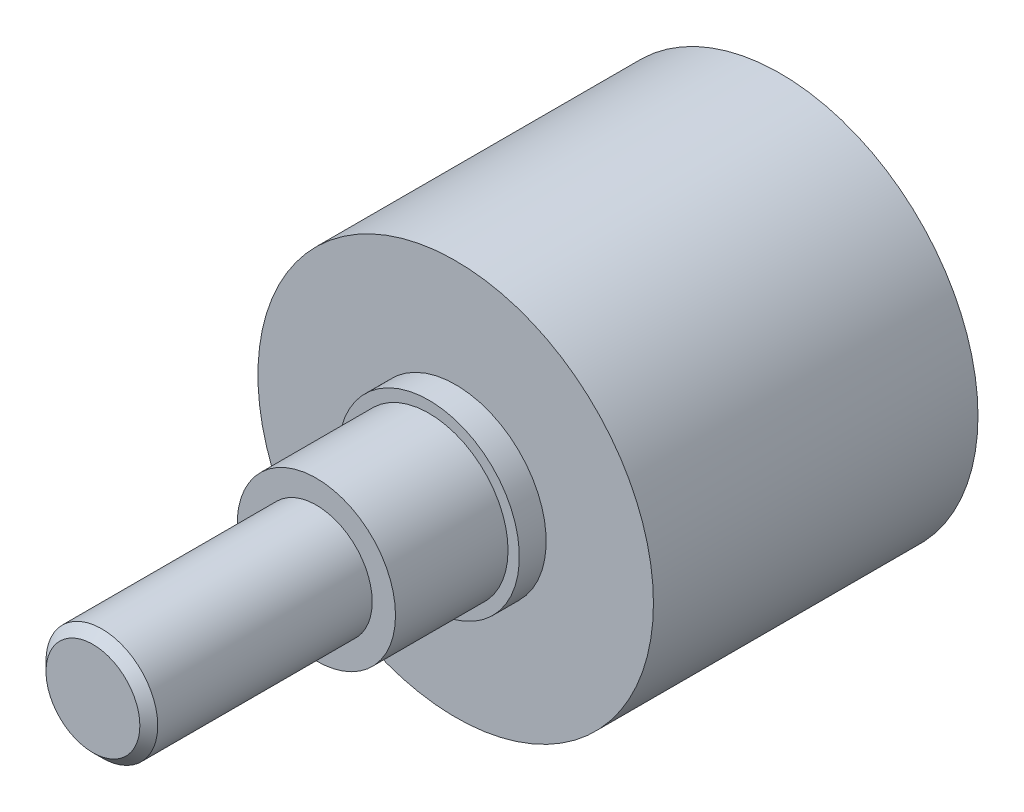
ISO-10303-21;
HEADER;
FILE_DESCRIPTION(('STEP AP214'),'2;1');
FILE_NAME('part.step','',(''),(''),'','','');
FILE_SCHEMA(('AUTOMOTIVE_DESIGN { 1 0 10303 214 1 1 1 1 }'));
ENDSEC;
DATA;
#1=APPLICATION_CONTEXT('core data for automotive mechanical design processes');
#2=APPLICATION_PROTOCOL_DEFINITION('international standard','automotive_design',2000,#1);
#3=PRODUCT_CONTEXT('',#1,'mechanical');
#4=PRODUCT('Part','Part','',(#3));
#5=PRODUCT_RELATED_PRODUCT_CATEGORY('part','',(#4));
#6=PRODUCT_DEFINITION_FORMATION('','',#4);
#7=PRODUCT_DEFINITION_CONTEXT('part definition',#1,'design');
#8=PRODUCT_DEFINITION('design','',#6,#7);
#9=PRODUCT_DEFINITION_SHAPE('','',#8);
#10=(LENGTH_UNIT() NAMED_UNIT(*) SI_UNIT(.MILLI.,.METRE.));
#11=(NAMED_UNIT(*) PLANE_ANGLE_UNIT() SI_UNIT($,.RADIAN.));
#12=(NAMED_UNIT(*) SI_UNIT($,.STERADIAN.) SOLID_ANGLE_UNIT());
#13=UNCERTAINTY_MEASURE_WITH_UNIT(LENGTH_MEASURE(1.E-05),#10,'distance_accuracy_value','');
#14=(GEOMETRIC_REPRESENTATION_CONTEXT(3) GLOBAL_UNCERTAINTY_ASSIGNED_CONTEXT((#13)) GLOBAL_UNIT_ASSIGNED_CONTEXT((#10,
#11,#12)) REPRESENTATION_CONTEXT('',''));
#15=CARTESIAN_POINT('',(0.,0.,0.));
#16=DIRECTION('',(0.,0.,1.));
#17=DIRECTION('',(1.,0.,0.));
#18=AXIS2_PLACEMENT_3D('',#15,#16,#17);
#19=CARTESIAN_POINT('',(0.,0.,26.366));
#20=DIRECTION('',(0.,0.,1.));
#21=DIRECTION('',(1.,0.,0.));
#22=AXIS2_PLACEMENT_3D('',#19,#20,#21);
#23=PLANE('',#22);
#24=CARTESIAN_POINT('',(0.,0.,26.366));
#25=DIRECTION('',(0.,0.,1.));
#26=DIRECTION('',(1.,0.,0.));
#27=AXIS2_PLACEMENT_3D('',#24,#25,#26);
#28=CIRCLE('',#27,4.50000000000017);
#29=CARTESIAN_POINT('',(4.50000000000017,0.,26.366));
#30=VERTEX_POINT('',#29);
#31=EDGE_CURVE('E60',#30,#30,#28,.T.);
#32=ORIENTED_EDGE('',*,*,#31,.T.);
#33=EDGE_LOOP('',(#32));
#34=FACE_BOUND('',#33,.T.);
#35=CARTESIAN_POINT('',(0.,0.,26.366));
#36=DIRECTION('',(0.,0.,1.));
#37=DIRECTION('',(1.,0.,0.));
#38=AXIS2_PLACEMENT_3D('',#35,#36,#37);
#39=CIRCLE('',#38,3.175);
#40=CARTESIAN_POINT('',(3.175,0.,26.366));
#41=VERTEX_POINT('',#40);
#42=EDGE_CURVE('E50',#41,#41,#39,.F.);
#43=ORIENTED_EDGE('',*,*,#42,.T.);
#44=EDGE_LOOP('',(#43));
#45=FACE_BOUND('',#44,.T.);
#46=ADVANCED_FACE('F32',(#34,#45),#23,.T.);
#47=CARTESIAN_POINT('',(0.,0.,19.97));
#48=DIRECTION('',(0.,0.,1.));
#49=DIRECTION('',(1.,0.,0.));
#50=AXIS2_PLACEMENT_3D('',#47,#48,#49);
#51=PLANE('',#50);
#52=CARTESIAN_POINT('',(0.,0.,19.97));
#53=DIRECTION('',(0.,0.,1.));
#54=DIRECTION('',(1.,0.,0.));
#55=AXIS2_PLACEMENT_3D('',#52,#53,#54);
#56=CIRCLE('',#55,5.1435);
#57=CARTESIAN_POINT('',(-5.1435,0.,19.97));
#58=VERTEX_POINT('',#57);
#59=EDGE_CURVE('E55',#58,#58,#56,.T.);
#60=ORIENTED_EDGE('',*,*,#59,.T.);
#61=EDGE_LOOP('',(#60));
#62=FACE_BOUND('',#61,.T.);
#63=CARTESIAN_POINT('',(0.,0.,19.97));
#64=DIRECTION('',(0.,0.,1.));
#65=DIRECTION('',(1.,0.,0.));
#66=AXIS2_PLACEMENT_3D('',#63,#64,#65);
#67=CIRCLE('',#66,4.50000000000017);
#68=CARTESIAN_POINT('',(4.50000000000017,0.,19.97));
#69=VERTEX_POINT('',#68);
#70=EDGE_CURVE('E53',#69,#69,#67,.T.);
#71=ORIENTED_EDGE('',*,*,#70,.F.);
#72=EDGE_LOOP('',(#71));
#73=FACE_BOUND('',#72,.T.);
#74=ADVANCED_FACE('F78',(#62,#73),#51,.T.);
#75=CARTESIAN_POINT('',(0.,0.,18.446));
#76=DIRECTION('',(0.,0.,1.));
#77=DIRECTION('',(1.,0.,0.));
#78=AXIS2_PLACEMENT_3D('',#75,#76,#77);
#79=PLANE('',#78);
#80=CARTESIAN_POINT('',(0.,0.,18.446));
#81=DIRECTION('',(0.,0.,1.));
#82=DIRECTION('',(1.,0.,0.));
#83=AXIS2_PLACEMENT_3D('',#80,#81,#82);
#84=CIRCLE('',#83,11.2395);
#85=CARTESIAN_POINT('',(11.2395,0.,18.446));
#86=VERTEX_POINT('',#85);
#87=EDGE_CURVE('E43',#86,#86,#84,.T.);
#88=ORIENTED_EDGE('',*,*,#87,.T.);
#89=EDGE_LOOP('',(#88));
#90=FACE_BOUND('',#89,.T.);
#91=CARTESIAN_POINT('',(0.,0.,18.446));
#92=DIRECTION('',(0.,0.,1.));
#93=DIRECTION('',(1.,0.,0.));
#94=AXIS2_PLACEMENT_3D('',#91,#92,#93);
#95=CIRCLE('',#94,5.1435);
#96=CARTESIAN_POINT('',(-5.1435,0.,18.446));
#97=VERTEX_POINT('',#96);
#98=EDGE_CURVE('E57',#97,#97,#95,.T.);
#99=ORIENTED_EDGE('',*,*,#98,.F.);
#100=EDGE_LOOP('',(#99));
#101=FACE_BOUND('',#100,.T.);
#102=ADVANCED_FACE('F80',(#90,#101),#79,.T.);
#103=CARTESIAN_POINT('',(0.,0.,18.446));
#104=DIRECTION('',(0.,0.,-1.));
#105=DIRECTION('',(-1.,0.,0.));
#106=AXIS2_PLACEMENT_3D('',#103,#104,#105);
#107=CYLINDRICAL_SURFACE('',#106,11.2395);
#108=ORIENTED_EDGE('',*,*,#87,.F.);
#109=EDGE_LOOP('',(#108));
#110=FACE_BOUND('',#109,.T.);
#111=CARTESIAN_POINT('',(0.,0.,0.));
#112=DIRECTION('',(0.,0.,1.));
#113=DIRECTION('',(1.,0.,0.));
#114=AXIS2_PLACEMENT_3D('',#111,#112,#113);
#115=CIRCLE('',#114,11.2395);
#116=CARTESIAN_POINT('',(11.2395,0.,0.));
#117=VERTEX_POINT('',#116);
#118=EDGE_CURVE('E47',#117,#117,#115,.T.);
#119=ORIENTED_EDGE('',*,*,#118,.T.);
#120=EDGE_LOOP('',(#119));
#121=FACE_BOUND('',#120,.T.);
#122=ADVANCED_FACE('F87',(#110,#121),#107,.T.);
#123=CARTESIAN_POINT('',(0.,0.,0.));
#124=DIRECTION('',(0.,0.,1.));
#125=DIRECTION('',(1.,0.,0.));
#126=AXIS2_PLACEMENT_3D('',#123,#124,#125);
#127=PLANE('',#126);
#128=ORIENTED_EDGE('',*,*,#118,.F.);
#129=EDGE_LOOP('',(#128));
#130=FACE_BOUND('',#129,.T.);
#131=ADVANCED_FACE('F93',(#130),#127,.F.);
#132=CARTESIAN_POINT('',(0.,0.,19.97));
#133=DIRECTION('',(0.,0.,-1.));
#134=DIRECTION('',(-1.,0.,0.));
#135=AXIS2_PLACEMENT_3D('',#132,#133,#134);
#136=CYLINDRICAL_SURFACE('',#135,5.1435);
#137=CARTESIAN_POINT('',(-5.1435,0.,19.97));
#138=CARTESIAN_POINT('',(-5.1435,0.,19.954125));
#139=CARTESIAN_POINT('',(-5.1435,0.,19.93825));
#140=CARTESIAN_POINT('',(-5.1435,0.,19.9065));
#141=CARTESIAN_POINT('',(-5.1435,0.,19.890625));
#142=CARTESIAN_POINT('',(-5.1435,0.,19.858875));
#143=CARTESIAN_POINT('',(-5.1435,0.,19.843));
#144=CARTESIAN_POINT('',(-5.1435,0.,19.81125));
#145=CARTESIAN_POINT('',(-5.1435,0.,19.795375));
#146=CARTESIAN_POINT('',(-5.1435,0.,19.763625));
#147=CARTESIAN_POINT('',(-5.1435,0.,19.74775));
#148=CARTESIAN_POINT('',(-5.1435,0.,19.716));
#149=CARTESIAN_POINT('',(-5.1435,0.,19.700125));
#150=CARTESIAN_POINT('',(-5.1435,0.,19.668375));
#151=CARTESIAN_POINT('',(-5.1435,0.,19.6525));
#152=CARTESIAN_POINT('',(-5.1435,0.,19.62075));
#153=CARTESIAN_POINT('',(-5.1435,0.,19.604875));
#154=CARTESIAN_POINT('',(-5.1435,0.,19.573125));
#155=CARTESIAN_POINT('',(-5.1435,0.,19.55725));
#156=CARTESIAN_POINT('',(-5.1435,0.,19.5255));
#157=CARTESIAN_POINT('',(-5.1435,0.,19.509625));
#158=CARTESIAN_POINT('',(-5.1435,0.,19.477875));
#159=CARTESIAN_POINT('',(-5.1435,0.,19.462));
#160=CARTESIAN_POINT('',(-5.1435,0.,19.43025));
#161=CARTESIAN_POINT('',(-5.1435,0.,19.414375));
#162=CARTESIAN_POINT('',(-5.1435,0.,19.382625));
#163=CARTESIAN_POINT('',(-5.1435,0.,19.36675));
#164=CARTESIAN_POINT('',(-5.1435,0.,19.335));
#165=CARTESIAN_POINT('',(-5.1435,0.,19.319125));
#166=CARTESIAN_POINT('',(-5.1435,0.,19.287375));
#167=CARTESIAN_POINT('',(-5.1435,0.,19.2715));
#168=CARTESIAN_POINT('',(-5.1435,0.,19.23975));
#169=CARTESIAN_POINT('',(-5.1435,0.,19.223875));
#170=CARTESIAN_POINT('',(-5.1435,0.,19.192125));
#171=CARTESIAN_POINT('',(-5.1435,0.,19.17625));
#172=CARTESIAN_POINT('',(-5.1435,0.,19.1445));
#173=CARTESIAN_POINT('',(-5.1435,0.,19.128625));
#174=CARTESIAN_POINT('',(-5.1435,0.,19.096875));
#175=CARTESIAN_POINT('',(-5.1435,0.,19.081));
#176=CARTESIAN_POINT('',(-5.1435,0.,19.04925));
#177=CARTESIAN_POINT('',(-5.1435,0.,19.033375));
#178=CARTESIAN_POINT('',(-5.1435,0.,19.001625));
#179=CARTESIAN_POINT('',(-5.1435,0.,18.98575));
#180=CARTESIAN_POINT('',(-5.1435,0.,18.954));
#181=CARTESIAN_POINT('',(-5.1435,0.,18.938125));
#182=CARTESIAN_POINT('',(-5.1435,0.,18.906375));
#183=CARTESIAN_POINT('',(-5.1435,0.,18.8905));
#184=CARTESIAN_POINT('',(-5.1435,0.,18.85875));
#185=CARTESIAN_POINT('',(-5.1435,0.,18.842875));
#186=CARTESIAN_POINT('',(-5.1435,0.,18.811125));
#187=CARTESIAN_POINT('',(-5.1435,0.,18.79525));
#188=CARTESIAN_POINT('',(-5.1435,0.,18.7635));
#189=CARTESIAN_POINT('',(-5.1435,0.,18.747625));
#190=CARTESIAN_POINT('',(-5.1435,0.,18.715875));
#191=CARTESIAN_POINT('',(-5.1435,0.,18.7));
#192=CARTESIAN_POINT('',(-5.1435,0.,18.66825));
#193=CARTESIAN_POINT('',(-5.1435,0.,18.652375));
#194=CARTESIAN_POINT('',(-5.1435,0.,18.620625));
#195=CARTESIAN_POINT('',(-5.1435,0.,18.60475));
#196=CARTESIAN_POINT('',(-5.1435,0.,18.573));
#197=CARTESIAN_POINT('',(-5.1435,0.,18.557125));
#198=CARTESIAN_POINT('',(-5.1435,0.,18.525375));
#199=CARTESIAN_POINT('',(-5.1435,0.,18.5095));
#200=CARTESIAN_POINT('',(-5.1435,0.,18.47775));
#201=CARTESIAN_POINT('',(-5.1435,0.,18.461875));
#202=CARTESIAN_POINT('',(-5.1435,0.,18.446));
#203=B_SPLINE_CURVE_WITH_KNOTS('',3,(#137,#138,#139,#140,#141,#142,#143,#144,#145,#146,#147,
#148,#149,#150,#151,#152,#153,#154,#155,#156,#157,#158,#159,#160,#161,#162,#163,#164,#165,#166,
#167,#168,#169,#170,#171,#172,#173,#174,#175,#176,#177,#178,#179,#180,#181,#182,#183,#184,#185,
#186,#187,#188,#189,#190,#191,#192,#193,#194,#195,#196,#197,#198,#199,#200,#201,#202),
.UNSPECIFIED.,.F.,.F.,(4,2,2,2,2,2,2,2,2,2,2,2,2,2,2,2,2,2,2,2,2,2,2,2,2,2,2,2,2,2,2,2,4),(0.,
0.0476249999999991,0.0952499999999981,0.142874999999997,0.1905,0.238124999999999,
0.285749999999998,0.333374999999997,0.380999999999999,0.428624999999998,0.476249999999998,
0.523875,0.571499999999999,0.619124999999998,0.666749999999997,0.714375,0.761999999999999,
0.809624999999998,0.85725,0.904874999999999,0.952499999999998,1.000125,1.04775,1.095375,1.143,
1.190625,1.23825,1.285875,1.3335,1.381125,1.42875,1.476375,1.524),.UNSPECIFIED.);
#204=EDGE_CURVE('BSEAM74',#58,#97,#203,.T.);
#205=ORIENTED_EDGE('',*,*,#59,.F.);
#206=ORIENTED_EDGE('',*,*,#98,.T.);
#207=ORIENTED_EDGE('',*,*,#204,.T.);
#208=ORIENTED_EDGE('',*,*,#204,.F.);
#209=EDGE_LOOP('',(#205,#207,#206,#208));
#210=FACE_BOUND('',#209,.T.);
#211=ADVANCED_FACE('F74',(#210),#136,.T.);
#212=CARTESIAN_POINT('',(0.,0.,26.366));
#213=DIRECTION('',(0.,0.,-1.));
#214=DIRECTION('',(-1.,0.,0.));
#215=AXIS2_PLACEMENT_3D('',#212,#213,#214);
#216=CYLINDRICAL_SURFACE('',#215,4.50000000000017);
#217=ORIENTED_EDGE('',*,*,#31,.F.);
#218=EDGE_LOOP('',(#217));
#219=FACE_BOUND('',#218,.T.);
#220=ORIENTED_EDGE('',*,*,#70,.T.);
#221=EDGE_LOOP('',(#220));
#222=FACE_BOUND('',#221,.T.);
#223=ADVANCED_FACE('F70',(#219,#222),#216,.T.);
#224=CARTESIAN_POINT('',(0.,0.,39.063));
#225=DIRECTION('',(0.,0.,-1.));
#226=DIRECTION('',(-1.,0.,0.));
#227=AXIS2_PLACEMENT_3D('',#224,#225,#226);
#228=CYLINDRICAL_SURFACE('',#227,3.175);
#229=CARTESIAN_POINT('',(0.,0.,38.555));
#230=DIRECTION('',(0.,0.,1.));
#231=DIRECTION('',(1.,0.,0.));
#232=AXIS2_PLACEMENT_3D('',#229,#230,#231);
#233=CIRCLE('',#232,3.175);
#234=CARTESIAN_POINT('',(3.175,0.,38.555));
#235=VERTEX_POINT('',#234);
#236=EDGE_CURVE('E10',#235,#235,#233,.F.);
#237=ORIENTED_EDGE('',*,*,#236,.T.);
#238=EDGE_LOOP('',(#237));
#239=FACE_BOUND('',#238,.T.);
#240=ORIENTED_EDGE('',*,*,#42,.F.);
#241=EDGE_LOOP('',(#240));
#242=FACE_BOUND('',#241,.T.);
#243=ADVANCED_FACE('F73',(#239,#242),#228,.T.);
#244=CARTESIAN_POINT('',(0.,0.,39.063));
#245=DIRECTION('',(0.,0.,1.));
#246=DIRECTION('',(1.,0.,0.));
#247=AXIS2_PLACEMENT_3D('',#244,#245,#246);
#248=PLANE('',#247);
#249=CARTESIAN_POINT('',(0.,0.,39.063));
#250=DIRECTION('',(0.,0.,1.));
#251=DIRECTION('',(1.,0.,0.));
#252=AXIS2_PLACEMENT_3D('',#249,#250,#251);
#253=CIRCLE('',#252,2.667);
#254=CARTESIAN_POINT('',(2.667,0.,39.063));
#255=VERTEX_POINT('',#254);
#256=EDGE_CURVE('E39',#255,#255,#253,.T.);
#257=ORIENTED_EDGE('',*,*,#256,.T.);
#258=EDGE_LOOP('',(#257));
#259=FACE_BOUND('',#258,.T.);
#260=ADVANCED_FACE('F129',(#259),#248,.T.);
#261=CARTESIAN_POINT('',(0.,0.,39.063));
#262=DIRECTION('',(0.,0.,-1.));
#263=DIRECTION('',(-1.,0.,0.));
#264=AXIS2_PLACEMENT_3D('',#261,#262,#263);
#265=CONICAL_SURFACE('',#264,2.667,0.785398163397444);
#266=ORIENTED_EDGE('',*,*,#236,.F.);
#267=EDGE_LOOP('',(#266));
#268=FACE_BOUND('',#267,.T.);
#269=ORIENTED_EDGE('',*,*,#256,.F.);
#270=EDGE_LOOP('',(#269));
#271=FACE_BOUND('',#270,.T.);
#272=ADVANCED_FACE('F34',(#268,#271),#265,.T.);
#273=CLOSED_SHELL('',(#46,#74,#102,#122,#131,#211,#223,#243,#260,#272));
#274=MANIFOLD_SOLID_BREP('B2',#273);
#275=ADVANCED_BREP_SHAPE_REPRESENTATION('',(#18,#274),#14);
#276=SHAPE_DEFINITION_REPRESENTATION(#9,#275);
ENDSEC;
END-ISO-10303-21;
